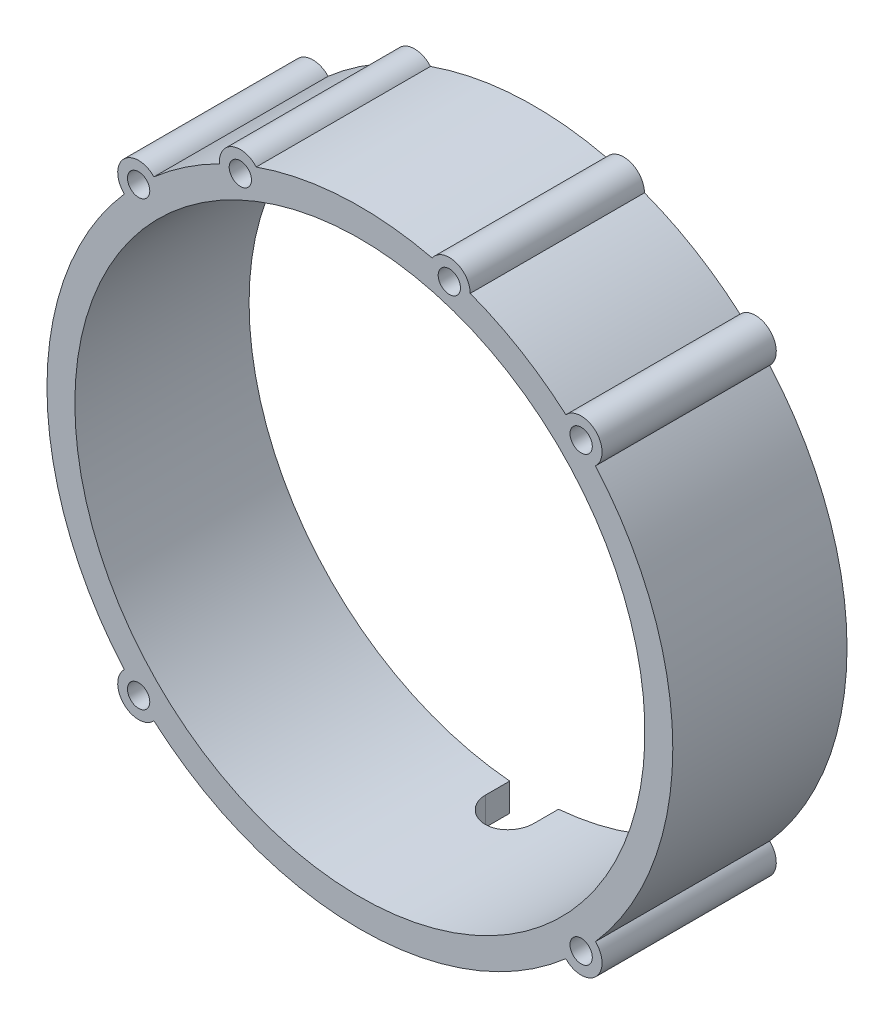
ISO-10303-21;
HEADER;
FILE_DESCRIPTION(('STEP AP214'),'2;1');
FILE_NAME('part.step','',(''),(''),'','','');
FILE_SCHEMA(('AUTOMOTIVE_DESIGN { 1 0 10303 214 1 1 1 1 }'));
ENDSEC;
DATA;
#1=APPLICATION_CONTEXT('core data for automotive mechanical design processes');
#2=APPLICATION_PROTOCOL_DEFINITION('international standard','automotive_design',2000,#1);
#3=PRODUCT_CONTEXT('',#1,'mechanical');
#4=PRODUCT('Part','Part','',(#3));
#5=PRODUCT_RELATED_PRODUCT_CATEGORY('part','',(#4));
#6=PRODUCT_DEFINITION_FORMATION('','',#4);
#7=PRODUCT_DEFINITION_CONTEXT('part definition',#1,'design');
#8=PRODUCT_DEFINITION('design','',#6,#7);
#9=PRODUCT_DEFINITION_SHAPE('','',#8);
#10=(LENGTH_UNIT() NAMED_UNIT(*) SI_UNIT(.MILLI.,.METRE.));
#11=(NAMED_UNIT(*) PLANE_ANGLE_UNIT() SI_UNIT($,.RADIAN.));
#12=(NAMED_UNIT(*) SI_UNIT($,.STERADIAN.) SOLID_ANGLE_UNIT());
#13=UNCERTAINTY_MEASURE_WITH_UNIT(LENGTH_MEASURE(1.E-05),#10,'distance_accuracy_value','');
#14=(GEOMETRIC_REPRESENTATION_CONTEXT(3) GLOBAL_UNCERTAINTY_ASSIGNED_CONTEXT((#13)) GLOBAL_UNIT_ASSIGNED_CONTEXT((#10,
#11,#12)) REPRESENTATION_CONTEXT('',''));
#15=CARTESIAN_POINT('',(0.,0.,0.));
#16=DIRECTION('',(0.,0.,1.));
#17=DIRECTION('',(1.,0.,0.));
#18=AXIS2_PLACEMENT_3D('',#15,#16,#17);
#19=CARTESIAN_POINT('',(0.,0.,25.));
#20=DIRECTION('',(0.,0.,1.));
#21=DIRECTION('',(1.,0.,0.));
#22=AXIS2_PLACEMENT_3D('',#19,#20,#21);
#23=PLANE('',#22);
#24=CARTESIAN_POINT('',(0.,0.,25.));
#25=DIRECTION('',(0.,0.,1.));
#26=DIRECTION('',(1.,0.,0.));
#27=AXIS2_PLACEMENT_3D('',#24,#25,#26);
#28=CIRCLE('',#27,44.9);
#29=CARTESIAN_POINT('',(10.3667662272661,43.6868419319732,25.));
#30=VERTEX_POINT('',#29);
#31=CARTESIAN_POINT('',(-14.8764944493471,42.3638986980489,25.));
#32=VERTEX_POINT('',#31);
#33=EDGE_CURVE('E295',#30,#32,#28,.T.);
#34=ORIENTED_EDGE('',*,*,#33,.T.);
#35=CARTESIAN_POINT('',(-17.1530965406794,40.410163066562,25.));
#36=DIRECTION('',(0.,0.,1.));
#37=DIRECTION('',(1.,0.,0.));
#38=AXIS2_PLACEMENT_3D('',#35,#36,#37);
#39=CIRCLE('',#38,3.);
#40=CARTESIAN_POINT('',(-20.1399570386961,40.1296913828088,25.));
#41=VERTEX_POINT('',#40);
#42=EDGE_CURVE('E367',#41,#32,#39,.F.);
#43=ORIENTED_EDGE('',*,*,#42,.F.);
#44=CARTESIAN_POINT('',(0.,0.,25.));
#45=DIRECTION('',(0.,0.,1.));
#46=DIRECTION('',(1.,0.,0.));
#47=AXIS2_PLACEMENT_3D('',#44,#45,#46);
#48=CIRCLE('',#47,44.9);
#49=CARTESIAN_POINT('',(-29.5580900659073,33.7983625587944,25.));
#50=VERTEX_POINT('',#49);
#51=EDGE_CURVE('E373',#41,#50,#48,.T.);
#52=ORIENTED_EDGE('',*,*,#51,.T.);
#53=CARTESIAN_POINT('',(-31.749094475276,31.749094475276,25.));
#54=DIRECTION('',(0.,0.,1.));
#55=DIRECTION('',(1.,0.,0.));
#56=AXIS2_PLACEMENT_3D('',#53,#54,#55);
#57=CIRCLE('',#56,3.);
#58=CARTESIAN_POINT('',(-33.7983625587943,29.5580900659073,25.));
#59=VERTEX_POINT('',#58);
#60=EDGE_CURVE('E196',#50,#59,#57,.T.);
#61=ORIENTED_EDGE('',*,*,#60,.T.);
#62=CARTESIAN_POINT('',(0.,0.,25.));
#63=DIRECTION('',(0.,0.,1.));
#64=DIRECTION('',(1.,0.,0.));
#65=AXIS2_PLACEMENT_3D('',#62,#63,#64);
#66=CIRCLE('',#65,44.9);
#67=CARTESIAN_POINT('',(-33.7983625587944,-29.5580900659072,25.));
#68=VERTEX_POINT('',#67);
#69=EDGE_CURVE('E188',#59,#68,#66,.T.);
#70=ORIENTED_EDGE('',*,*,#69,.T.);
#71=CARTESIAN_POINT('',(-31.749094475276,-31.749094475276,25.));
#72=DIRECTION('',(0.,0.,1.));
#73=DIRECTION('',(1.,0.,0.));
#74=AXIS2_PLACEMENT_3D('',#71,#72,#73);
#75=CIRCLE('',#74,3.);
#76=CARTESIAN_POINT('',(-29.5580900659072,-33.7983625587944,25.));
#77=VERTEX_POINT('',#76);
#78=EDGE_CURVE('E170',#68,#77,#75,.T.);
#79=ORIENTED_EDGE('',*,*,#78,.T.);
#80=CARTESIAN_POINT('',(0.,0.,25.));
#81=DIRECTION('',(0.,0.,1.));
#82=DIRECTION('',(1.,0.,0.));
#83=AXIS2_PLACEMENT_3D('',#80,#81,#82);
#84=CIRCLE('',#83,44.9);
#85=CARTESIAN_POINT('',(29.5580900659072,-33.7983625587944,25.));
#86=VERTEX_POINT('',#85);
#87=EDGE_CURVE('E190',#77,#86,#84,.T.);
#88=ORIENTED_EDGE('',*,*,#87,.T.);
#89=CARTESIAN_POINT('',(31.749094475276,-31.749094475276,25.));
#90=DIRECTION('',(0.,0.,1.));
#91=DIRECTION('',(1.,0.,0.));
#92=AXIS2_PLACEMENT_3D('',#89,#90,#91);
#93=CIRCLE('',#92,3.);
#94=CARTESIAN_POINT('',(33.7983625587944,-29.5580900659073,25.));
#95=VERTEX_POINT('',#94);
#96=EDGE_CURVE('E232',#86,#95,#93,.T.);
#97=ORIENTED_EDGE('',*,*,#96,.T.);
#98=CARTESIAN_POINT('',(0.,0.,25.));
#99=DIRECTION('',(0.,0.,1.));
#100=DIRECTION('',(1.,0.,0.));
#101=AXIS2_PLACEMENT_3D('',#98,#99,#100);
#102=CIRCLE('',#101,44.9);
#103=CARTESIAN_POINT('',(33.7983625587944,29.5580900659073,25.));
#104=VERTEX_POINT('',#103);
#105=EDGE_CURVE('E410',#104,#95,#102,.F.);
#106=ORIENTED_EDGE('',*,*,#105,.F.);
#107=CARTESIAN_POINT('',(31.749094475276,31.749094475276,25.));
#108=DIRECTION('',(0.,0.,1.));
#109=DIRECTION('',(1.,0.,0.));
#110=AXIS2_PLACEMENT_3D('',#107,#108,#109);
#111=CIRCLE('',#110,2.99999999999999);
#112=CARTESIAN_POINT('',(29.5580900659073,33.7983625587944,25.));
#113=VERTEX_POINT('',#112);
#114=EDGE_CURVE('E237',#104,#113,#111,.T.);
#115=ORIENTED_EDGE('',*,*,#114,.T.);
#116=CARTESIAN_POINT('',(0.,0.,25.));
#117=DIRECTION('',(0.,0.,1.));
#118=DIRECTION('',(1.,0.,0.));
#119=AXIS2_PLACEMENT_3D('',#116,#117,#118);
#120=CIRCLE('',#119,44.9);
#121=CARTESIAN_POINT('',(15.8349332751089,42.0150554941065,25.));
#122=VERTEX_POINT('',#121);
#123=EDGE_CURVE('E398',#113,#122,#120,.T.);
#124=ORIENTED_EDGE('',*,*,#123,.T.);
#125=CARTESIAN_POINT('',(12.8351178373279,41.9817787867773,25.));
#126=DIRECTION('',(0.,0.,1.));
#127=DIRECTION('',(1.,0.,0.));
#128=AXIS2_PLACEMENT_3D('',#125,#126,#127);
#129=CIRCLE('',#128,3.);
#130=EDGE_CURVE('E381',#122,#30,#129,.T.);
#131=ORIENTED_EDGE('',*,*,#130,.T.);
#132=EDGE_LOOP('',(#34,#43,#52,#61,#70,#79,#88,#97,#106,#115,#124,#131));
#133=FACE_BOUND('',#132,.T.);
#134=CARTESIAN_POINT('',(31.749094475276,31.749094475276,25.));
#135=DIRECTION('',(0.,0.,1.));
#136=DIRECTION('',(1.,0.,0.));
#137=AXIS2_PLACEMENT_3D('',#134,#135,#136);
#138=CIRCLE('',#137,1.6);
#139=CARTESIAN_POINT('',(33.349094475276,31.749094475276,25.));
#140=VERTEX_POINT('',#139);
#141=EDGE_CURVE('E223',#140,#140,#138,.T.);
#142=ORIENTED_EDGE('',*,*,#141,.F.);
#143=EDGE_LOOP('',(#142));
#144=FACE_BOUND('',#143,.T.);
#145=CARTESIAN_POINT('',(31.749094475276,-31.749094475276,25.));
#146=DIRECTION('',(0.,0.,1.));
#147=DIRECTION('',(1.,0.,0.));
#148=AXIS2_PLACEMENT_3D('',#145,#146,#147);
#149=CIRCLE('',#148,1.6);
#150=CARTESIAN_POINT('',(33.349094475276,-31.749094475276,25.));
#151=VERTEX_POINT('',#150);
#152=EDGE_CURVE('E217',#151,#151,#149,.T.);
#153=ORIENTED_EDGE('',*,*,#152,.F.);
#154=EDGE_LOOP('',(#153));
#155=FACE_BOUND('',#154,.T.);
#156=CARTESIAN_POINT('',(-31.749094475276,-31.749094475276,25.));
#157=DIRECTION('',(0.,0.,1.));
#158=DIRECTION('',(1.,0.,0.));
#159=AXIS2_PLACEMENT_3D('',#156,#157,#158);
#160=CIRCLE('',#159,1.6);
#161=CARTESIAN_POINT('',(-30.149094475276,-31.749094475276,25.));
#162=VERTEX_POINT('',#161);
#163=EDGE_CURVE('E211',#162,#162,#160,.T.);
#164=ORIENTED_EDGE('',*,*,#163,.F.);
#165=EDGE_LOOP('',(#164));
#166=FACE_BOUND('',#165,.T.);
#167=CARTESIAN_POINT('',(-31.749094475276,31.749094475276,25.));
#168=DIRECTION('',(0.,0.,1.));
#169=DIRECTION('',(1.,0.,0.));
#170=AXIS2_PLACEMENT_3D('',#167,#168,#169);
#171=CIRCLE('',#170,1.6);
#172=CARTESIAN_POINT('',(-30.149094475276,31.749094475276,25.));
#173=VERTEX_POINT('',#172);
#174=EDGE_CURVE('E210',#173,#173,#171,.T.);
#175=ORIENTED_EDGE('',*,*,#174,.F.);
#176=EDGE_LOOP('',(#175));
#177=FACE_BOUND('',#176,.T.);
#178=CARTESIAN_POINT('',(12.8351178373279,41.9817787867773,25.));
#179=DIRECTION('',(0.,0.,1.));
#180=DIRECTION('',(1.,0.,0.));
#181=AXIS2_PLACEMENT_3D('',#178,#179,#180);
#182=CIRCLE('',#181,1.6);
#183=CARTESIAN_POINT('',(14.4351178373279,41.9817787867773,25.));
#184=VERTEX_POINT('',#183);
#185=EDGE_CURVE('E250',#184,#184,#182,.T.);
#186=ORIENTED_EDGE('',*,*,#185,.F.);
#187=EDGE_LOOP('',(#186));
#188=FACE_BOUND('',#187,.T.);
#189=CARTESIAN_POINT('',(0.,0.,25.));
#190=DIRECTION('',(0.,0.,1.));
#191=DIRECTION('',(-1.,0.,0.));
#192=AXIS2_PLACEMENT_3D('',#189,#190,#191);
#193=CIRCLE('',#192,40.9);
#194=CARTESIAN_POINT('',(-40.9,0.,25.));
#195=VERTEX_POINT('',#194);
#196=EDGE_CURVE('E256',#195,#195,#193,.T.);
#197=ORIENTED_EDGE('',*,*,#196,.F.);
#198=EDGE_LOOP('',(#197));
#199=FACE_BOUND('',#198,.T.);
#200=CARTESIAN_POINT('',(-17.1530965406794,40.410163066562,25.));
#201=DIRECTION('',(0.,0.,1.));
#202=DIRECTION('',(1.,0.,0.));
#203=AXIS2_PLACEMENT_3D('',#200,#201,#202);
#204=CIRCLE('',#203,1.6);
#205=CARTESIAN_POINT('',(-15.5530965406794,40.410163066562,25.));
#206=VERTEX_POINT('',#205);
#207=EDGE_CURVE('E244',#206,#206,#204,.T.);
#208=ORIENTED_EDGE('',*,*,#207,.F.);
#209=EDGE_LOOP('',(#208));
#210=FACE_BOUND('',#209,.T.);
#211=ADVANCED_FACE('F86',(#133,#144,#155,#166,#177,#188,#199,#210),#23,.T.);
#212=CARTESIAN_POINT('',(0.,0.,0.));
#213=DIRECTION('',(0.,0.,1.));
#214=DIRECTION('',(1.,0.,0.));
#215=AXIS2_PLACEMENT_3D('',#212,#213,#214);
#216=PLANE('',#215);
#217=CARTESIAN_POINT('',(-17.1530965406794,40.410163066562,0.));
#218=DIRECTION('',(0.,0.,1.));
#219=DIRECTION('',(1.,0.,0.));
#220=AXIS2_PLACEMENT_3D('',#217,#218,#219);
#221=CIRCLE('',#220,1.6);
#222=CARTESIAN_POINT('',(-15.5530965406794,40.410163066562,0.));
#223=VERTEX_POINT('',#222);
#224=EDGE_CURVE('E243',#223,#223,#221,.T.);
#225=ORIENTED_EDGE('',*,*,#224,.T.);
#226=EDGE_LOOP('',(#225));
#227=FACE_BOUND('',#226,.T.);
#228=CARTESIAN_POINT('',(12.8351178373279,41.9817787867773,0.));
#229=DIRECTION('',(0.,0.,1.));
#230=DIRECTION('',(1.,0.,0.));
#231=AXIS2_PLACEMENT_3D('',#228,#229,#230);
#232=CIRCLE('',#231,1.6);
#233=CARTESIAN_POINT('',(14.4351178373279,41.9817787867773,0.));
#234=VERTEX_POINT('',#233);
#235=EDGE_CURVE('E247',#234,#234,#232,.T.);
#236=ORIENTED_EDGE('',*,*,#235,.T.);
#237=EDGE_LOOP('',(#236));
#238=FACE_BOUND('',#237,.T.);
#239=CARTESIAN_POINT('',(-31.749094475276,31.749094475276,0.));
#240=DIRECTION('',(0.,0.,1.));
#241=DIRECTION('',(1.,0.,0.));
#242=AXIS2_PLACEMENT_3D('',#239,#240,#241);
#243=CIRCLE('',#242,1.6);
#244=CARTESIAN_POINT('',(-30.149094475276,31.749094475276,0.));
#245=VERTEX_POINT('',#244);
#246=EDGE_CURVE('E181',#245,#245,#243,.T.);
#247=ORIENTED_EDGE('',*,*,#246,.T.);
#248=EDGE_LOOP('',(#247));
#249=FACE_BOUND('',#248,.T.);
#250=CARTESIAN_POINT('',(-31.749094475276,-31.749094475276,0.));
#251=DIRECTION('',(0.,0.,1.));
#252=DIRECTION('',(1.,0.,0.));
#253=AXIS2_PLACEMENT_3D('',#250,#251,#252);
#254=CIRCLE('',#253,1.6);
#255=CARTESIAN_POINT('',(-30.149094475276,-31.749094475276,0.));
#256=VERTEX_POINT('',#255);
#257=EDGE_CURVE('E207',#256,#256,#254,.T.);
#258=ORIENTED_EDGE('',*,*,#257,.T.);
#259=EDGE_LOOP('',(#258));
#260=FACE_BOUND('',#259,.T.);
#261=CARTESIAN_POINT('',(31.749094475276,-31.749094475276,0.));
#262=DIRECTION('',(0.,0.,1.));
#263=DIRECTION('',(1.,0.,0.));
#264=AXIS2_PLACEMENT_3D('',#261,#262,#263);
#265=CIRCLE('',#264,1.6);
#266=CARTESIAN_POINT('',(33.349094475276,-31.749094475276,0.));
#267=VERTEX_POINT('',#266);
#268=EDGE_CURVE('E214',#267,#267,#265,.T.);
#269=ORIENTED_EDGE('',*,*,#268,.T.);
#270=EDGE_LOOP('',(#269));
#271=FACE_BOUND('',#270,.T.);
#272=CARTESIAN_POINT('',(31.749094475276,31.749094475276,0.));
#273=DIRECTION('',(0.,0.,1.));
#274=DIRECTION('',(1.,0.,0.));
#275=AXIS2_PLACEMENT_3D('',#272,#273,#274);
#276=CIRCLE('',#275,1.6);
#277=CARTESIAN_POINT('',(33.349094475276,31.749094475276,0.));
#278=VERTEX_POINT('',#277);
#279=EDGE_CURVE('E220',#278,#278,#276,.T.);
#280=ORIENTED_EDGE('',*,*,#279,.T.);
#281=EDGE_LOOP('',(#280));
#282=FACE_BOUND('',#281,.T.);
#283=CARTESIAN_POINT('',(0.,0.,0.));
#284=DIRECTION('',(0.,0.,1.));
#285=DIRECTION('',(1.,0.,0.));
#286=AXIS2_PLACEMENT_3D('',#283,#284,#285);
#287=CIRCLE('',#286,40.9);
#288=CARTESIAN_POINT('',(3.5,-40.7499693251418,0.));
#289=VERTEX_POINT('',#288);
#290=CARTESIAN_POINT('',(-3.5,-40.7499693251418,0.));
#291=VERTEX_POINT('',#290);
#292=EDGE_CURVE('E253',#289,#291,#287,.T.);
#293=ORIENTED_EDGE('',*,*,#292,.T.);
#294=DIRECTION('',(0.,1.,0.));
#295=VECTOR('',#294,1.);
#296=CARTESIAN_POINT('',(-3.5,-44.9,0.));
#297=LINE('',#296,#295);
#298=CARTESIAN_POINT('',(-3.5,-44.7633778886268,0.));
#299=VERTEX_POINT('',#298);
#300=EDGE_CURVE('E331',#299,#291,#297,.T.);
#301=ORIENTED_EDGE('',*,*,#300,.F.);
#302=CARTESIAN_POINT('',(0.,0.,0.));
#303=DIRECTION('',(0.,0.,1.));
#304=DIRECTION('',(1.,0.,0.));
#305=AXIS2_PLACEMENT_3D('',#302,#303,#304);
#306=CIRCLE('',#305,44.9);
#307=CARTESIAN_POINT('',(-29.5580900659072,-33.7983625587944,0.));
#308=VERTEX_POINT('',#307);
#309=EDGE_CURVE('E417',#308,#299,#306,.T.);
#310=ORIENTED_EDGE('',*,*,#309,.F.);
#311=CARTESIAN_POINT('',(-31.749094475276,-31.749094475276,0.));
#312=DIRECTION('',(0.,0.,1.));
#313=DIRECTION('',(1.,0.,0.));
#314=AXIS2_PLACEMENT_3D('',#311,#312,#313);
#315=CIRCLE('',#314,3.);
#316=CARTESIAN_POINT('',(-33.7983625587944,-29.5580900659072,0.));
#317=VERTEX_POINT('',#316);
#318=EDGE_CURVE('E180',#308,#317,#315,.F.);
#319=ORIENTED_EDGE('',*,*,#318,.T.);
#320=CARTESIAN_POINT('',(0.,0.,0.));
#321=DIRECTION('',(0.,0.,1.));
#322=DIRECTION('',(1.,0.,0.));
#323=AXIS2_PLACEMENT_3D('',#320,#321,#322);
#324=CIRCLE('',#323,44.9);
#325=CARTESIAN_POINT('',(-33.7983625587943,29.5580900659073,0.));
#326=VERTEX_POINT('',#325);
#327=EDGE_CURVE('E189',#326,#317,#324,.T.);
#328=ORIENTED_EDGE('',*,*,#327,.F.);
#329=CARTESIAN_POINT('',(-31.749094475276,31.749094475276,0.));
#330=DIRECTION('',(0.,0.,1.));
#331=DIRECTION('',(1.,0.,0.));
#332=AXIS2_PLACEMENT_3D('',#329,#330,#331);
#333=CIRCLE('',#332,3.);
#334=CARTESIAN_POINT('',(-29.5580900659073,33.7983625587944,0.));
#335=VERTEX_POINT('',#334);
#336=EDGE_CURVE('E109',#326,#335,#333,.F.);
#337=ORIENTED_EDGE('',*,*,#336,.T.);
#338=CARTESIAN_POINT('',(0.,0.,0.));
#339=DIRECTION('',(0.,0.,1.));
#340=DIRECTION('',(1.,0.,0.));
#341=AXIS2_PLACEMENT_3D('',#338,#339,#340);
#342=CIRCLE('',#341,44.9);
#343=CARTESIAN_POINT('',(-20.1399570386961,40.1296913828088,0.));
#344=VERTEX_POINT('',#343);
#345=EDGE_CURVE('E372',#344,#335,#342,.T.);
#346=ORIENTED_EDGE('',*,*,#345,.F.);
#347=CARTESIAN_POINT('',(-17.1530965406794,40.410163066562,0.));
#348=DIRECTION('',(0.,0.,1.));
#349=DIRECTION('',(1.,0.,0.));
#350=AXIS2_PLACEMENT_3D('',#347,#348,#349);
#351=CIRCLE('',#350,3.);
#352=CARTESIAN_POINT('',(-14.8764944493471,42.3638986980489,0.));
#353=VERTEX_POINT('',#352);
#354=EDGE_CURVE('E386',#344,#353,#351,.F.);
#355=ORIENTED_EDGE('',*,*,#354,.T.);
#356=CARTESIAN_POINT('',(0.,0.,0.));
#357=DIRECTION('',(0.,0.,1.));
#358=DIRECTION('',(1.,0.,0.));
#359=AXIS2_PLACEMENT_3D('',#356,#357,#358);
#360=CIRCLE('',#359,44.9);
#361=CARTESIAN_POINT('',(10.3667662272661,43.6868419319732,0.));
#362=VERTEX_POINT('',#361);
#363=EDGE_CURVE('E298',#362,#353,#360,.T.);
#364=ORIENTED_EDGE('',*,*,#363,.F.);
#365=CARTESIAN_POINT('',(12.8351178373279,41.9817787867773,0.));
#366=DIRECTION('',(0.,0.,1.));
#367=DIRECTION('',(1.,0.,0.));
#368=AXIS2_PLACEMENT_3D('',#365,#366,#367);
#369=CIRCLE('',#368,3.);
#370=CARTESIAN_POINT('',(15.8349332751089,42.0150554941065,0.));
#371=VERTEX_POINT('',#370);
#372=EDGE_CURVE('E395',#371,#362,#369,.T.);
#373=ORIENTED_EDGE('',*,*,#372,.F.);
#374=CARTESIAN_POINT('',(0.,0.,0.));
#375=DIRECTION('',(0.,0.,1.));
#376=DIRECTION('',(1.,0.,0.));
#377=AXIS2_PLACEMENT_3D('',#374,#375,#376);
#378=CIRCLE('',#377,44.9);
#379=CARTESIAN_POINT('',(29.5580900659073,33.7983625587944,0.));
#380=VERTEX_POINT('',#379);
#381=EDGE_CURVE('E393',#380,#371,#378,.T.);
#382=ORIENTED_EDGE('',*,*,#381,.F.);
#383=CARTESIAN_POINT('',(31.749094475276,31.749094475276,0.));
#384=DIRECTION('',(0.,0.,1.));
#385=DIRECTION('',(1.,0.,0.));
#386=AXIS2_PLACEMENT_3D('',#383,#384,#385);
#387=CIRCLE('',#386,2.99999999999999);
#388=CARTESIAN_POINT('',(33.7983625587944,29.5580900659073,0.));
#389=VERTEX_POINT('',#388);
#390=EDGE_CURVE('E239',#380,#389,#387,.F.);
#391=ORIENTED_EDGE('',*,*,#390,.T.);
#392=CARTESIAN_POINT('',(0.,0.,0.));
#393=DIRECTION('',(0.,0.,1.));
#394=DIRECTION('',(1.,0.,0.));
#395=AXIS2_PLACEMENT_3D('',#392,#393,#394);
#396=CIRCLE('',#395,44.9);
#397=CARTESIAN_POINT('',(33.7983625587944,-29.5580900659073,0.));
#398=VERTEX_POINT('',#397);
#399=EDGE_CURVE('E406',#389,#398,#396,.F.);
#400=ORIENTED_EDGE('',*,*,#399,.T.);
#401=CARTESIAN_POINT('',(31.749094475276,-31.749094475276,0.));
#402=DIRECTION('',(0.,0.,1.));
#403=DIRECTION('',(1.,0.,0.));
#404=AXIS2_PLACEMENT_3D('',#401,#402,#403);
#405=CIRCLE('',#404,3.);
#406=CARTESIAN_POINT('',(29.5580900659072,-33.7983625587944,0.));
#407=VERTEX_POINT('',#406);
#408=EDGE_CURVE('E234',#398,#407,#405,.F.);
#409=ORIENTED_EDGE('',*,*,#408,.T.);
#410=CARTESIAN_POINT('',(3.5,-44.7633778886268,0.));
#411=VERTEX_POINT('',#410);
#412=EDGE_CURVE('E420',#411,#407,#306,.T.);
#413=ORIENTED_EDGE('',*,*,#412,.F.);
#414=DIRECTION('',(0.,1.,0.));
#415=VECTOR('',#414,1.);
#416=CARTESIAN_POINT('',(3.5,-44.9,0.));
#417=LINE('',#416,#415);
#418=EDGE_CURVE('E100',#411,#289,#417,.T.);
#419=ORIENTED_EDGE('',*,*,#418,.T.);
#420=EDGE_LOOP('',(#293,#301,#310,#319,#328,#337,#346,#355,#364,#373,#382,#391,#400,#409,#413,#419));
#421=FACE_BOUND('',#420,.T.);
#422=ADVANCED_FACE('F88',(#227,#238,#249,#260,#271,#282,#421),#216,.F.);
#423=CARTESIAN_POINT('',(0.,0.,25.));
#424=DIRECTION('',(0.,0.,-1.));
#425=DIRECTION('',(-1.,0.,0.));
#426=AXIS2_PLACEMENT_3D('',#423,#424,#425);
#427=CYLINDRICAL_SURFACE('',#426,40.9);
#428=DIRECTION('',(0.,0.,-1.));
#429=VECTOR('',#428,1.);
#430=CARTESIAN_POINT('',(-3.5,-40.7499693251418,25.));
#431=LINE('',#430,#429);
#432=CARTESIAN_POINT('',(-3.5,-40.7499693251418,3.5));
#433=VERTEX_POINT('',#432);
#434=EDGE_CURVE('E296',#291,#433,#431,.F.);
#435=ORIENTED_EDGE('',*,*,#434,.F.);
#436=ORIENTED_EDGE('',*,*,#292,.F.);
#437=DIRECTION('',(0.,0.,-1.));
#438=VECTOR('',#437,1.);
#439=CARTESIAN_POINT('',(3.5,-40.7499693251418,25.));
#440=LINE('',#439,#438);
#441=CARTESIAN_POINT('',(3.5,-40.7499693251418,3.5));
#442=VERTEX_POINT('',#441);
#443=EDGE_CURVE('E342',#442,#289,#440,.T.);
#444=ORIENTED_EDGE('',*,*,#443,.F.);
#445=CARTESIAN_POINT('',(-3.5,-40.7499693251418,3.5));
#446=CARTESIAN_POINT('',(-3.50000964048092,-40.7499658427961,3.59824909595129));
#447=CARTESIAN_POINT('',(-3.49586309882002,-40.7503245730504,3.6964934745691));
#448=CARTESIAN_POINT('',(-3.47933229120163,-40.7517407338276,3.89227581227808));
#449=CARTESIAN_POINT('',(-3.46694853151288,-40.7527981214102,3.98981381441155));
#450=CARTESIAN_POINT('',(-3.43403195642767,-40.7555846887573,4.18341604896146));
#451=CARTESIAN_POINT('',(-3.41350610156376,-40.7573132946826,4.27948146759436));
#452=CARTESIAN_POINT('',(-3.36447463084468,-40.7613899407994,4.46951172588773));
#453=CARTESIAN_POINT('',(-3.33596908892979,-40.7637379752512,4.56347658500341));
#454=CARTESIAN_POINT('',(-3.23872360136853,-40.771619643036,4.8413004568433));
#455=CARTESIAN_POINT('',(-3.15823856935434,-40.777992301763,5.02118364135841));
#456=CARTESIAN_POINT('',(-2.96837303193688,-40.7922512329031,5.36476235218107));
#457=CARTESIAN_POINT('',(-2.85899659413601,-40.8001372922029,5.52846015276317));
#458=CARTESIAN_POINT('',(-2.61411506768438,-40.816558601666,5.83560318623674));
#459=CARTESIAN_POINT('',(-2.4785503330118,-40.82509530633,5.97900086673616));
#460=CARTESIAN_POINT('',(-2.18525779678196,-40.841843498283,6.24104642540193));
#461=CARTESIAN_POINT('',(-2.0275266267288,-40.8500549358998,6.35969053510023));
#462=CARTESIAN_POINT('',(-1.69409556703837,-40.8652406224088,6.56901322890935));
#463=CARTESIAN_POINT('',(-1.5183690361253,-40.8722129939341,6.65964952802438));
#464=CARTESIAN_POINT('',(-1.15413303232907,-40.8841184594225,6.8101056987528));
#465=CARTESIAN_POINT('',(-0.965624570891555,-40.8890517145241,6.86992800549212));
#466=CARTESIAN_POINT('',(-0.581655814625004,-40.8963132582187,6.95692512339592));
#467=CARTESIAN_POINT('',(-0.386213686142801,-40.8986479002963,6.98417957347958));
#468=CARTESIAN_POINT('',(0.00648882199237209,-40.9004707320439,7.00551348326747));
#469=CARTESIAN_POINT('',(0.203749210773618,-40.899958907416,6.99959277633064));
#470=CARTESIAN_POINT('',(0.593937852867385,-40.8961516085632,6.95480839186038));
#471=CARTESIAN_POINT('',(0.786876127210241,-40.8928634520649,6.91603131467869));
#472=CARTESIAN_POINT('',(1.16349461085666,-40.883881738657,6.80676973727158));
#473=CARTESIAN_POINT('',(1.34717477241873,-40.8781881693447,6.73628507355762));
#474=CARTESIAN_POINT('',(1.70034273168692,-40.8650233971963,6.56551126813345));
#475=CARTESIAN_POINT('',(1.8698114189533,-40.8575498510228,6.46518279336582));
#476=CARTESIAN_POINT('',(2.189528531622,-40.8416653177443,6.23760241788658));
#477=CARTESIAN_POINT('',(2.33977742444571,-40.8332543534466,6.11035117213094));
#478=CARTESIAN_POINT('',(2.61728543737407,-40.8164090153748,5.83207011346642));
#479=CARTESIAN_POINT('',(2.7444724566926,-40.8079746491316,5.68096839764916));
#480=CARTESIAN_POINT('',(2.9717262837295,-40.7920564292354,5.35946127711144));
#481=CARTESIAN_POINT('',(3.07178474606407,-40.7845728684478,5.18904995510817));
#482=CARTESIAN_POINT('',(3.24193509477707,-40.7714014180471,4.83368751845717));
#483=CARTESIAN_POINT('',(3.31200505210223,-40.7657148432699,4.64872588051051));
#484=CARTESIAN_POINT('',(3.41996920170108,-40.7568005895101,4.26974302575383));
#485=CARTESIAN_POINT('',(3.45791218300174,-40.7535691828021,4.07573602001078));
#486=CARTESIAN_POINT('',(3.48619850630497,-40.7511525795988,3.81699106052656));
#487=CARTESIAN_POINT('',(3.49137668341357,-40.7507091245758,3.75364822686948));
#488=CARTESIAN_POINT('',(3.49827274151485,-40.7501178708733,3.62687899817979));
#489=CARTESIAN_POINT('',(3.49999638097419,-40.7499695801789,3.56345291885567));
#490=CARTESIAN_POINT('',(3.5,-40.7499693251418,3.5));
#491=B_SPLINE_CURVE_WITH_KNOTS('',3,(#445,#446,#447,#448,#449,#450,#451,#452,#453,#454,#455,
#456,#457,#458,#459,#460,#461,#462,#463,#464,#465,#466,#467,#468,#469,#470,#471,#472,#473,#474,
#475,#476,#477,#478,#479,#480,#481,#482,#483,#484,#485,#486,#487,#488,#489,#490),.UNSPECIFIED.,
.F.,.F.,(4,2,2,2,2,2,2,2,2,2,2,2,2,2,2,2,2,2,2,2,2,2,4),(0.,0.294650714459899,0.589283321026421,
0.883664592366965,1.17804313604296,1.76651506364897,2.35490418479021,2.9446495566645,
3.53448464559534,4.12520593995873,4.71588054444503,5.30510778367457,5.89433798263518,
6.48201994670111,7.06970494096827,7.65816794060906,8.24661662623089,8.83687446029531,
9.42731366609713,10.0181838951009,10.6081551925136,10.7987547004879,10.989036227611),.UNSPECIFIED.);
#492=EDGE_CURVE('E286',#433,#442,#491,.T.);
#493=ORIENTED_EDGE('',*,*,#492,.F.);
#494=EDGE_LOOP('',(#435,#436,#444,#493));
#495=FACE_BOUND('',#494,.T.);
#496=ORIENTED_EDGE('',*,*,#196,.T.);
#497=EDGE_LOOP('',(#496));
#498=FACE_BOUND('',#497,.T.);
#499=ADVANCED_FACE('F300',(#495,#498),#427,.F.);
#500=CARTESIAN_POINT('',(12.8351178373279,41.9817787867773,25.));
#501=DIRECTION('',(0.,0.,-1.));
#502=DIRECTION('',(-1.,0.,0.));
#503=AXIS2_PLACEMENT_3D('',#500,#501,#502);
#504=CYLINDRICAL_SURFACE('',#503,1.6);
#505=ORIENTED_EDGE('',*,*,#185,.T.);
#506=EDGE_LOOP('',(#505));
#507=FACE_BOUND('',#506,.T.);
#508=ORIENTED_EDGE('',*,*,#235,.F.);
#509=EDGE_LOOP('',(#508));
#510=FACE_BOUND('',#509,.T.);
#511=ADVANCED_FACE('F304',(#507,#510),#504,.F.);
#512=CARTESIAN_POINT('',(-17.1530965406794,40.410163066562,25.));
#513=DIRECTION('',(0.,0.,-1.));
#514=DIRECTION('',(-1.,0.,0.));
#515=AXIS2_PLACEMENT_3D('',#512,#513,#514);
#516=CYLINDRICAL_SURFACE('',#515,1.6);
#517=ORIENTED_EDGE('',*,*,#207,.T.);
#518=EDGE_LOOP('',(#517));
#519=FACE_BOUND('',#518,.T.);
#520=ORIENTED_EDGE('',*,*,#224,.F.);
#521=EDGE_LOOP('',(#520));
#522=FACE_BOUND('',#521,.T.);
#523=ADVANCED_FACE('F572',(#519,#522),#516,.F.);
#524=CARTESIAN_POINT('',(-31.749094475276,31.749094475276,-8.48528137423858));
#525=DIRECTION('',(0.,0.,1.));
#526=DIRECTION('',(1.,0.,0.));
#527=AXIS2_PLACEMENT_3D('',#524,#525,#526);
#528=CYLINDRICAL_SURFACE('',#527,3.);
#529=ORIENTED_EDGE('',*,*,#60,.F.);
#530=DIRECTION('',(0.,0.,1.));
#531=VECTOR('',#530,1.);
#532=CARTESIAN_POINT('',(-29.5580900659073,33.7983625587944,0.));
#533=LINE('',#532,#531);
#534=EDGE_CURVE('E226',#335,#50,#533,.T.);
#535=ORIENTED_EDGE('',*,*,#534,.F.);
#536=ORIENTED_EDGE('',*,*,#336,.F.);
#537=DIRECTION('',(0.,0.,1.));
#538=VECTOR('',#537,1.);
#539=CARTESIAN_POINT('',(-33.7983625587943,29.5580900659073,0.));
#540=LINE('',#539,#538);
#541=EDGE_CURVE('E191',#326,#59,#540,.T.);
#542=ORIENTED_EDGE('',*,*,#541,.T.);
#543=EDGE_LOOP('',(#529,#535,#536,#542));
#544=FACE_BOUND('',#543,.T.);
#545=ADVANCED_FACE('F449',(#544),#528,.T.);
#546=CARTESIAN_POINT('',(31.749094475276,31.749094475276,-8.48528137423858));
#547=DIRECTION('',(0.,0.,1.));
#548=DIRECTION('',(1.,0.,0.));
#549=AXIS2_PLACEMENT_3D('',#546,#547,#548);
#550=CYLINDRICAL_SURFACE('',#549,2.99999999999999);
#551=ORIENTED_EDGE('',*,*,#114,.F.);
#552=DIRECTION('',(0.,0.,1.));
#553=VECTOR('',#552,1.);
#554=CARTESIAN_POINT('',(33.7983625587944,29.5580900659073,0.));
#555=LINE('',#554,#553);
#556=EDGE_CURVE('E409',#389,#104,#555,.T.);
#557=ORIENTED_EDGE('',*,*,#556,.F.);
#558=ORIENTED_EDGE('',*,*,#390,.F.);
#559=DIRECTION('',(0.,0.,1.));
#560=VECTOR('',#559,1.);
#561=CARTESIAN_POINT('',(29.5580900659073,33.7983625587944,0.));
#562=LINE('',#561,#560);
#563=EDGE_CURVE('E397',#380,#113,#562,.T.);
#564=ORIENTED_EDGE('',*,*,#563,.T.);
#565=EDGE_LOOP('',(#551,#557,#558,#564));
#566=FACE_BOUND('',#565,.T.);
#567=ADVANCED_FACE('F435',(#566),#550,.T.);
#568=CARTESIAN_POINT('',(31.749094475276,-31.749094475276,-8.48528137423858));
#569=DIRECTION('',(0.,0.,1.));
#570=DIRECTION('',(1.,0.,0.));
#571=AXIS2_PLACEMENT_3D('',#568,#569,#570);
#572=CYLINDRICAL_SURFACE('',#571,3.);
#573=ORIENTED_EDGE('',*,*,#96,.F.);
#574=DIRECTION('',(0.,0.,1.));
#575=VECTOR('',#574,1.);
#576=CARTESIAN_POINT('',(29.5580900659072,-33.7983625587944,0.));
#577=LINE('',#576,#575);
#578=EDGE_CURVE('E419',#407,#86,#577,.T.);
#579=ORIENTED_EDGE('',*,*,#578,.F.);
#580=ORIENTED_EDGE('',*,*,#408,.F.);
#581=DIRECTION('',(0.,0.,1.));
#582=VECTOR('',#581,1.);
#583=CARTESIAN_POINT('',(33.7983625587944,-29.5580900659073,0.));
#584=LINE('',#583,#582);
#585=EDGE_CURVE('E400',#398,#95,#584,.T.);
#586=ORIENTED_EDGE('',*,*,#585,.T.);
#587=EDGE_LOOP('',(#573,#579,#580,#586));
#588=FACE_BOUND('',#587,.T.);
#589=ADVANCED_FACE('F429',(#588),#572,.T.);
#590=CARTESIAN_POINT('',(-31.749094475276,-31.749094475276,-8.48528137423858));
#591=DIRECTION('',(0.,0.,1.));
#592=DIRECTION('',(1.,0.,0.));
#593=AXIS2_PLACEMENT_3D('',#590,#591,#592);
#594=CYLINDRICAL_SURFACE('',#593,3.);
#595=ORIENTED_EDGE('',*,*,#78,.F.);
#596=DIRECTION('',(0.,0.,1.));
#597=VECTOR('',#596,1.);
#598=CARTESIAN_POINT('',(-33.7983625587944,-29.5580900659072,0.));
#599=LINE('',#598,#597);
#600=EDGE_CURVE('E173',#317,#68,#599,.T.);
#601=ORIENTED_EDGE('',*,*,#600,.F.);
#602=ORIENTED_EDGE('',*,*,#318,.F.);
#603=DIRECTION('',(0.,0.,1.));
#604=VECTOR('',#603,1.);
#605=CARTESIAN_POINT('',(-29.5580900659072,-33.7983625587944,0.));
#606=LINE('',#605,#604);
#607=EDGE_CURVE('E175',#308,#77,#606,.T.);
#608=ORIENTED_EDGE('',*,*,#607,.T.);
#609=EDGE_LOOP('',(#595,#601,#602,#608));
#610=FACE_BOUND('',#609,.T.);
#611=ADVANCED_FACE('F172',(#610),#594,.T.);
#612=CARTESIAN_POINT('',(-31.749094475276,31.749094475276,0.));
#613=DIRECTION('',(0.,0.,1.));
#614=DIRECTION('',(1.,0.,0.));
#615=AXIS2_PLACEMENT_3D('',#612,#613,#614);
#616=CYLINDRICAL_SURFACE('',#615,1.6);
#617=ORIENTED_EDGE('',*,*,#246,.F.);
#618=EDGE_LOOP('',(#617));
#619=FACE_BOUND('',#618,.T.);
#620=ORIENTED_EDGE('',*,*,#174,.T.);
#621=EDGE_LOOP('',(#620));
#622=FACE_BOUND('',#621,.T.);
#623=ADVANCED_FACE('F540',(#619,#622),#616,.F.);
#624=CARTESIAN_POINT('',(-31.749094475276,-31.749094475276,0.));
#625=DIRECTION('',(0.,0.,1.));
#626=DIRECTION('',(1.,0.,0.));
#627=AXIS2_PLACEMENT_3D('',#624,#625,#626);
#628=CYLINDRICAL_SURFACE('',#627,1.6);
#629=ORIENTED_EDGE('',*,*,#257,.F.);
#630=EDGE_LOOP('',(#629));
#631=FACE_BOUND('',#630,.T.);
#632=ORIENTED_EDGE('',*,*,#163,.T.);
#633=EDGE_LOOP('',(#632));
#634=FACE_BOUND('',#633,.T.);
#635=ADVANCED_FACE('F532',(#631,#634),#628,.F.);
#636=CARTESIAN_POINT('',(31.749094475276,-31.749094475276,0.));
#637=DIRECTION('',(0.,0.,1.));
#638=DIRECTION('',(1.,0.,0.));
#639=AXIS2_PLACEMENT_3D('',#636,#637,#638);
#640=CYLINDRICAL_SURFACE('',#639,1.6);
#641=ORIENTED_EDGE('',*,*,#268,.F.);
#642=EDGE_LOOP('',(#641));
#643=FACE_BOUND('',#642,.T.);
#644=ORIENTED_EDGE('',*,*,#152,.T.);
#645=EDGE_LOOP('',(#644));
#646=FACE_BOUND('',#645,.T.);
#647=ADVANCED_FACE('F523',(#643,#646),#640,.F.);
#648=CARTESIAN_POINT('',(31.749094475276,31.749094475276,0.));
#649=DIRECTION('',(0.,0.,1.));
#650=DIRECTION('',(1.,0.,0.));
#651=AXIS2_PLACEMENT_3D('',#648,#649,#650);
#652=CYLINDRICAL_SURFACE('',#651,1.6);
#653=ORIENTED_EDGE('',*,*,#279,.F.);
#654=EDGE_LOOP('',(#653));
#655=FACE_BOUND('',#654,.T.);
#656=ORIENTED_EDGE('',*,*,#141,.T.);
#657=EDGE_LOOP('',(#656));
#658=FACE_BOUND('',#657,.T.);
#659=ADVANCED_FACE('F516',(#655,#658),#652,.F.);
#660=CARTESIAN_POINT('',(0.,0.,0.));
#661=DIRECTION('',(0.,0.,1.));
#662=DIRECTION('',(1.,0.,0.));
#663=AXIS2_PLACEMENT_3D('',#660,#661,#662);
#664=CYLINDRICAL_SURFACE('',#663,44.9);
#665=ORIENTED_EDGE('',*,*,#69,.F.);
#666=ORIENTED_EDGE('',*,*,#541,.F.);
#667=ORIENTED_EDGE('',*,*,#327,.T.);
#668=ORIENTED_EDGE('',*,*,#600,.T.);
#669=EDGE_LOOP('',(#665,#666,#667,#668));
#670=FACE_BOUND('',#669,.T.);
#671=ADVANCED_FACE('F186',(#670),#664,.T.);
#672=CARTESIAN_POINT('',(0.,0.,0.));
#673=DIRECTION('',(0.,0.,1.));
#674=DIRECTION('',(1.,0.,0.));
#675=AXIS2_PLACEMENT_3D('',#672,#673,#674);
#676=CYLINDRICAL_SURFACE('',#675,44.9);
#677=CARTESIAN_POINT('',(3.5,-44.7633778886268,3.5));
#678=CARTESIAN_POINT('',(3.50000960474245,-44.7633747208575,3.59828171982175));
#679=CARTESIAN_POINT('',(3.49586034826426,-44.7637015006138,3.69655876405734));
#680=CARTESIAN_POINT('',(3.4793184710148,-44.7649915561636,3.89240680463495));
#681=CARTESIAN_POINT('',(3.4669263377296,-44.7659547943169,3.98997784238547));
#682=CARTESIAN_POINT('',(3.43398668263772,-44.7684933220832,4.18364879850476));
#683=CARTESIAN_POINT('',(3.41344591768482,-44.7700681045803,4.27974986737787));
#684=CARTESIAN_POINT('',(3.36437794371068,-44.7737820678763,4.46985114531916));
#685=CARTESIAN_POINT('',(3.33585081263611,-44.7759212431667,4.56385137488179));
#686=CARTESIAN_POINT('',(3.23852912061639,-44.7831020607386,4.84178232482582));
#687=CARTESIAN_POINT('',(3.15797840212347,-44.788908294715,5.02173601956829));
#688=CARTESIAN_POINT('',(2.96795250729651,-44.8019002210702,5.36544134164519));
#689=CARTESIAN_POINT('',(2.85848167626447,-44.8090857061696,5.52919539792998));
#690=CARTESIAN_POINT('',(2.61343506049279,-44.8240450387008,5.83636610914623));
#691=CARTESIAN_POINT('',(2.47780966099231,-44.8318199870465,5.97974319683932));
#692=CARTESIAN_POINT('',(2.18439915685326,-44.8470727855947,6.24173254690161));
#693=CARTESIAN_POINT('',(2.02661068406102,-44.8545505904178,6.3603410383265));
#694=CARTESIAN_POINT('',(1.69312208733441,-44.8683761788688,6.56954835007493));
#695=CARTESIAN_POINT('',(1.51740003993265,-44.8747225526808,6.66011232770159));
#696=CARTESIAN_POINT('',(1.15319741077576,-44.8855576901582,6.81042932323622));
#697=CARTESIAN_POINT('',(0.964717805627962,-44.8900465958285,6.87018469657127));
#698=CARTESIAN_POINT('',(0.580746484207754,-44.896653646246,6.95707978419725));
#699=CARTESIAN_POINT('',(0.385269791588703,-44.8987765888788,6.98428551348533));
#700=CARTESIAN_POINT('',(-0.00749106443814312,-44.9004287708203,7.00551299815313));
#701=CARTESIAN_POINT('',(-0.204775242419055,-44.8999579891982,6.99953448574449));
#702=CARTESIAN_POINT('',(-0.595092566471804,-44.8964796440063,6.95461619334253));
#703=CARTESIAN_POINT('',(-0.788134049970819,-44.8934776186624,6.91574837273816));
#704=CARTESIAN_POINT('',(-1.16494379372431,-44.8852809322364,6.80626672219239));
#705=CARTESIAN_POINT('',(-1.34871201873726,-44.8800862628221,6.73565277161502));
#706=CARTESIAN_POINT('',(-1.70199277888392,-44.8680791800231,6.56460121429222));
#707=CARTESIAN_POINT('',(-1.87148929792201,-44.8612649810827,6.46413065936686));
#708=CARTESIAN_POINT('',(-2.19123160829209,-44.8467853759798,6.23624641923475));
#709=CARTESIAN_POINT('',(-2.34147794913615,-44.8391199941267,6.10883350339501));
#710=CARTESIAN_POINT('',(-2.61886455442493,-44.8237764714614,5.83029622846735));
#711=CARTESIAN_POINT('',(-2.74594543845943,-44.8160983473913,5.67911273333173));
#712=CARTESIAN_POINT('',(-2.97297258122708,-44.8016118259601,5.35746709132314));
#713=CARTESIAN_POINT('',(-3.07291044343098,-44.7948036980713,5.18699900192559));
#714=CARTESIAN_POINT('',(-3.24280796962679,-44.7828257691834,4.8315604204994));
#715=CARTESIAN_POINT('',(-3.31274657128627,-44.7776571199151,4.64657984676227));
#716=CARTESIAN_POINT('',(-3.42045056804077,-44.7695597889626,4.26759271096918));
#717=CARTESIAN_POINT('',(-3.45826480519031,-44.7666277074843,4.07360032590708));
#718=CARTESIAN_POINT('',(-3.48635165661392,-44.7644431198624,3.81523073526899));
#719=CARTESIAN_POINT('',(-3.49147239473944,-44.7640438906619,3.75223833281094));
#720=CARTESIAN_POINT('',(-3.49829192248696,-44.7635116149658,3.6261726098262));
#721=CARTESIAN_POINT('',(-3.49999639902261,-44.7633781261055,3.56309959896164));
#722=CARTESIAN_POINT('',(-3.5,-44.7633778886268,3.5));
#723=B_SPLINE_CURVE_WITH_KNOTS('',3,(#677,#678,#679,#680,#681,#682,#683,#684,#685,#686,#687,
#688,#689,#690,#691,#692,#693,#694,#695,#696,#697,#698,#699,#700,#701,#702,#703,#704,#705,#706,
#707,#708,#709,#710,#711,#712,#713,#714,#715,#716,#717,#718,#719,#720,#721,#722),.UNSPECIFIED.,
.F.,.F.,(4,2,2,2,2,2,2,2,2,2,2,2,2,2,2,2,2,2,2,2,2,2,4),(0.,0.29474867723438,0.589479924498616,
0.883967289435624,1.17845178028568,1.7671421103556,2.35574403883908,2.94547371814697,
3.53529311667219,4.12584239776252,4.71634652256789,5.30565098542284,5.8949602038209,
6.48298338088558,7.07100879246992,7.65968554313867,8.24834548580258,8.83849375953549,
9.42882438466606,10.0195688022804,10.6094134332371,10.7989517008767,10.9881741888364),.UNSPECIFIED.);
#724=CARTESIAN_POINT('',(3.5,-44.7633778886268,3.5));
#725=VERTEX_POINT('',#724);
#726=CARTESIAN_POINT('',(-3.5,-44.7633778886268,3.5));
#727=VERTEX_POINT('',#726);
#728=EDGE_CURVE('E259',#725,#727,#723,.T.);
#729=ORIENTED_EDGE('',*,*,#728,.F.);
#730=DIRECTION('',(0.,0.,1.));
#731=VECTOR('',#730,1.);
#732=CARTESIAN_POINT('',(3.5,-44.7633778886268,0.));
#733=LINE('',#732,#731);
#734=EDGE_CURVE('E12',#411,#725,#733,.T.);
#735=ORIENTED_EDGE('',*,*,#734,.F.);
#736=ORIENTED_EDGE('',*,*,#412,.T.);
#737=ORIENTED_EDGE('',*,*,#578,.T.);
#738=ORIENTED_EDGE('',*,*,#87,.F.);
#739=ORIENTED_EDGE('',*,*,#607,.F.);
#740=ORIENTED_EDGE('',*,*,#309,.T.);
#741=DIRECTION('',(0.,0.,1.));
#742=VECTOR('',#741,1.);
#743=CARTESIAN_POINT('',(-3.5,-44.7633778886268,0.));
#744=LINE('',#743,#742);
#745=EDGE_CURVE('E94',#727,#299,#744,.F.);
#746=ORIENTED_EDGE('',*,*,#745,.F.);
#747=EDGE_LOOP('',(#729,#735,#736,#737,#738,#739,#740,#746));
#748=FACE_BOUND('',#747,.T.);
#749=ADVANCED_FACE('F269',(#748),#676,.T.);
#750=CARTESIAN_POINT('',(0.,0.,0.));
#751=DIRECTION('',(0.,0.,1.));
#752=DIRECTION('',(1.,0.,0.));
#753=AXIS2_PLACEMENT_3D('',#750,#751,#752);
#754=CYLINDRICAL_SURFACE('',#753,44.9);
#755=ORIENTED_EDGE('',*,*,#105,.T.);
#756=ORIENTED_EDGE('',*,*,#585,.F.);
#757=ORIENTED_EDGE('',*,*,#399,.F.);
#758=ORIENTED_EDGE('',*,*,#556,.T.);
#759=EDGE_LOOP('',(#755,#756,#757,#758));
#760=FACE_BOUND('',#759,.T.);
#761=ADVANCED_FACE('F432',(#760),#754,.T.);
#762=CARTESIAN_POINT('',(0.,0.,0.));
#763=DIRECTION('',(0.,0.,1.));
#764=DIRECTION('',(1.,0.,0.));
#765=AXIS2_PLACEMENT_3D('',#762,#763,#764);
#766=CYLINDRICAL_SURFACE('',#765,44.9);
#767=ORIENTED_EDGE('',*,*,#123,.F.);
#768=ORIENTED_EDGE('',*,*,#563,.F.);
#769=ORIENTED_EDGE('',*,*,#381,.T.);
#770=DIRECTION('',(0.,0.,1.));
#771=VECTOR('',#770,1.);
#772=CARTESIAN_POINT('',(15.8349332751089,42.0150554941065,0.));
#773=LINE('',#772,#771);
#774=EDGE_CURVE('E388',#371,#122,#773,.T.);
#775=ORIENTED_EDGE('',*,*,#774,.T.);
#776=EDGE_LOOP('',(#767,#768,#769,#775));
#777=FACE_BOUND('',#776,.T.);
#778=ADVANCED_FACE('F439',(#777),#766,.T.);
#779=CARTESIAN_POINT('',(12.8351178373279,41.9817787867773,0.));
#780=DIRECTION('',(0.,0.,1.));
#781=DIRECTION('',(1.,0.,0.));
#782=AXIS2_PLACEMENT_3D('',#779,#780,#781);
#783=CYLINDRICAL_SURFACE('',#782,3.);
#784=ORIENTED_EDGE('',*,*,#130,.F.);
#785=ORIENTED_EDGE('',*,*,#774,.F.);
#786=ORIENTED_EDGE('',*,*,#372,.T.);
#787=DIRECTION('',(0.,0.,1.));
#788=VECTOR('',#787,1.);
#789=CARTESIAN_POINT('',(10.3667662272661,43.6868419319732,0.));
#790=LINE('',#789,#788);
#791=EDGE_CURVE('E202',#362,#30,#790,.T.);
#792=ORIENTED_EDGE('',*,*,#791,.T.);
#793=EDGE_LOOP('',(#784,#785,#786,#792));
#794=FACE_BOUND('',#793,.T.);
#795=ADVANCED_FACE('F444',(#794),#783,.T.);
#796=CARTESIAN_POINT('',(0.,0.,0.));
#797=DIRECTION('',(0.,0.,1.));
#798=DIRECTION('',(1.,0.,0.));
#799=AXIS2_PLACEMENT_3D('',#796,#797,#798);
#800=CYLINDRICAL_SURFACE('',#799,44.9);
#801=ORIENTED_EDGE('',*,*,#51,.F.);
#802=DIRECTION('',(0.,0.,1.));
#803=VECTOR('',#802,1.);
#804=CARTESIAN_POINT('',(-20.1399570386961,40.1296913828088,0.));
#805=LINE('',#804,#803);
#806=EDGE_CURVE('E370',#344,#41,#805,.T.);
#807=ORIENTED_EDGE('',*,*,#806,.F.);
#808=ORIENTED_EDGE('',*,*,#345,.T.);
#809=ORIENTED_EDGE('',*,*,#534,.T.);
#810=EDGE_LOOP('',(#801,#807,#808,#809));
#811=FACE_BOUND('',#810,.T.);
#812=ADVANCED_FACE('F447',(#811),#800,.T.);
#813=CARTESIAN_POINT('',(-17.1530965406794,40.410163066562,0.));
#814=DIRECTION('',(0.,0.,1.));
#815=DIRECTION('',(1.,0.,0.));
#816=AXIS2_PLACEMENT_3D('',#813,#814,#815);
#817=CYLINDRICAL_SURFACE('',#816,3.);
#818=ORIENTED_EDGE('',*,*,#42,.T.);
#819=DIRECTION('',(0.,0.,1.));
#820=VECTOR('',#819,1.);
#821=CARTESIAN_POINT('',(-14.8764944493471,42.3638986980489,0.));
#822=LINE('',#821,#820);
#823=EDGE_CURVE('E198',#353,#32,#822,.T.);
#824=ORIENTED_EDGE('',*,*,#823,.F.);
#825=ORIENTED_EDGE('',*,*,#354,.F.);
#826=ORIENTED_EDGE('',*,*,#806,.T.);
#827=EDGE_LOOP('',(#818,#824,#825,#826));
#828=FACE_BOUND('',#827,.T.);
#829=ADVANCED_FACE('F368',(#828),#817,.T.);
#830=CARTESIAN_POINT('',(0.,0.,0.));
#831=DIRECTION('',(0.,0.,1.));
#832=DIRECTION('',(1.,0.,0.));
#833=AXIS2_PLACEMENT_3D('',#830,#831,#832);
#834=CYLINDRICAL_SURFACE('',#833,44.9);
#835=ORIENTED_EDGE('',*,*,#33,.F.);
#836=ORIENTED_EDGE('',*,*,#791,.F.);
#837=ORIENTED_EDGE('',*,*,#363,.T.);
#838=ORIENTED_EDGE('',*,*,#823,.T.);
#839=EDGE_LOOP('',(#835,#836,#837,#838));
#840=FACE_BOUND('',#839,.T.);
#841=ADVANCED_FACE('F279',(#840),#834,.T.);
#842=CARTESIAN_POINT('',(0.,-44.9,3.5));
#843=DIRECTION('',(0.,1.,0.));
#844=DIRECTION('',(0.,0.,1.));
#845=AXIS2_PLACEMENT_3D('',#842,#843,#844);
#846=CYLINDRICAL_SURFACE('',#845,3.5);
#847=ORIENTED_EDGE('',*,*,#492,.T.);
#848=DIRECTION('',(0.,1.,0.));
#849=VECTOR('',#848,1.);
#850=CARTESIAN_POINT('',(3.5,-44.9,3.5));
#851=LINE('',#850,#849);
#852=EDGE_CURVE('E459',#725,#442,#851,.T.);
#853=ORIENTED_EDGE('',*,*,#852,.F.);
#854=ORIENTED_EDGE('',*,*,#728,.T.);
#855=DIRECTION('',(0.,1.,0.));
#856=VECTOR('',#855,1.);
#857=CARTESIAN_POINT('',(-3.5,-44.9,3.5));
#858=LINE('',#857,#856);
#859=EDGE_CURVE('E454',#727,#433,#858,.T.);
#860=ORIENTED_EDGE('',*,*,#859,.T.);
#861=EDGE_LOOP('',(#847,#853,#854,#860));
#862=FACE_BOUND('',#861,.T.);
#863=ADVANCED_FACE('F273',(#862),#846,.F.);
#864=CARTESIAN_POINT('',(-3.5,-44.9,3.5));
#865=DIRECTION('',(-1.,0.,0.));
#866=DIRECTION('',(0.,0.,1.));
#867=AXIS2_PLACEMENT_3D('',#864,#865,#866);
#868=PLANE('',#867);
#869=ORIENTED_EDGE('',*,*,#434,.T.);
#870=ORIENTED_EDGE('',*,*,#859,.F.);
#871=ORIENTED_EDGE('',*,*,#745,.T.);
#872=ORIENTED_EDGE('',*,*,#300,.T.);
#873=EDGE_LOOP('',(#869,#870,#871,#872));
#874=FACE_BOUND('',#873,.T.);
#875=ADVANCED_FACE('F278',(#874),#868,.F.);
#876=CARTESIAN_POINT('',(3.5,-44.9,0.));
#877=DIRECTION('',(1.,0.,0.));
#878=DIRECTION('',(0.,0.,-1.));
#879=AXIS2_PLACEMENT_3D('',#876,#877,#878);
#880=PLANE('',#879);
#881=ORIENTED_EDGE('',*,*,#443,.T.);
#882=ORIENTED_EDGE('',*,*,#418,.F.);
#883=ORIENTED_EDGE('',*,*,#734,.T.);
#884=ORIENTED_EDGE('',*,*,#852,.T.);
#885=EDGE_LOOP('',(#881,#882,#883,#884));
#886=FACE_BOUND('',#885,.T.);
#887=ADVANCED_FACE('F281',(#886),#880,.F.);
#888=CLOSED_SHELL('',(#211,#422,#499,#511,#523,#545,#567,#589,#611,#623,#635,#647,#659,#671,
#749,#761,#778,#795,#812,#829,#841,#863,#875,#887));
#889=MANIFOLD_SOLID_BREP('B2',#888);
#890=ADVANCED_BREP_SHAPE_REPRESENTATION('',(#18,#889),#14);
#891=SHAPE_DEFINITION_REPRESENTATION(#9,#890);
ENDSEC;
END-ISO-10303-21;
